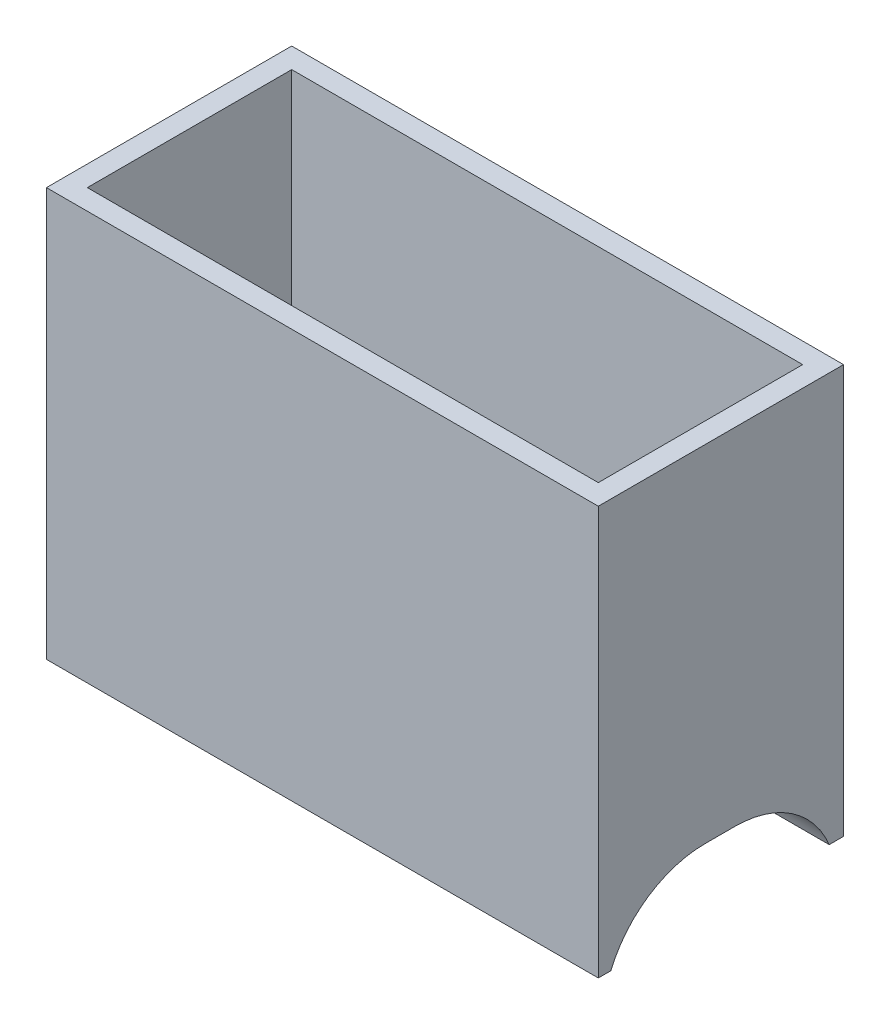
ISO-10303-21;
HEADER;
FILE_DESCRIPTION(('STEP AP214'),'2;1');
FILE_NAME('part.step','',(''),(''),'','','');
FILE_SCHEMA(('AUTOMOTIVE_DESIGN { 1 0 10303 214 1 1 1 1 }'));
ENDSEC;
DATA;
#1=APPLICATION_CONTEXT('core data for automotive mechanical design processes');
#2=APPLICATION_PROTOCOL_DEFINITION('international standard','automotive_design',2000,#1);
#3=PRODUCT_CONTEXT('',#1,'mechanical');
#4=PRODUCT('Part','Part','',(#3));
#5=PRODUCT_RELATED_PRODUCT_CATEGORY('part','',(#4));
#6=PRODUCT_DEFINITION_FORMATION('','',#4);
#7=PRODUCT_DEFINITION_CONTEXT('part definition',#1,'design');
#8=PRODUCT_DEFINITION('design','',#6,#7);
#9=PRODUCT_DEFINITION_SHAPE('','',#8);
#10=(LENGTH_UNIT() NAMED_UNIT(*) SI_UNIT(.MILLI.,.METRE.));
#11=(NAMED_UNIT(*) PLANE_ANGLE_UNIT() SI_UNIT($,.RADIAN.));
#12=(NAMED_UNIT(*) SI_UNIT($,.STERADIAN.) SOLID_ANGLE_UNIT());
#13=UNCERTAINTY_MEASURE_WITH_UNIT(LENGTH_MEASURE(1.E-05),#10,'distance_accuracy_value','');
#14=(GEOMETRIC_REPRESENTATION_CONTEXT(3) GLOBAL_UNCERTAINTY_ASSIGNED_CONTEXT((#13)) GLOBAL_UNIT_ASSIGNED_CONTEXT((#10,
#11,#12)) REPRESENTATION_CONTEXT('',''));
#15=CARTESIAN_POINT('',(0.,0.,0.));
#16=DIRECTION('',(0.,0.,1.));
#17=DIRECTION('',(1.,0.,0.));
#18=AXIS2_PLACEMENT_3D('',#15,#16,#17);
#19=CARTESIAN_POINT('',(0.,30.,0.));
#20=DIRECTION('',(0.,-1.,0.));
#21=DIRECTION('',(1.,0.,0.));
#22=AXIS2_PLACEMENT_3D('',#19,#20,#21);
#23=PLANE('',#22);
#24=DIRECTION('',(1.,0.,0.));
#25=VECTOR('',#24,1.);
#26=CARTESIAN_POINT('',(0.,30.,2.));
#27=LINE('',#26,#25);
#28=CARTESIAN_POINT('',(-52.,30.,2.00000000000001));
#29=VERTEX_POINT('',#28);
#30=CARTESIAN_POINT('',(2.,30.,2.));
#31=VERTEX_POINT('',#30);
#32=EDGE_CURVE('E230',#29,#31,#27,.T.);
#33=ORIENTED_EDGE('',*,*,#32,.T.);
#34=DIRECTION('',(0.,0.,-1.));
#35=VECTOR('',#34,1.);
#36=CARTESIAN_POINT('',(2.,30.,0.));
#37=LINE('',#36,#35);
#38=CARTESIAN_POINT('',(2.,30.,-22.));
#39=VERTEX_POINT('',#38);
#40=EDGE_CURVE('E160',#31,#39,#37,.T.);
#41=ORIENTED_EDGE('',*,*,#40,.T.);
#42=DIRECTION('',(-1.,0.,0.));
#43=VECTOR('',#42,1.);
#44=CARTESIAN_POINT('',(0.,30.,-22.));
#45=LINE('',#44,#43);
#46=CARTESIAN_POINT('',(-52.,30.,-22.));
#47=VERTEX_POINT('',#46);
#48=EDGE_CURVE('E155',#39,#47,#45,.T.);
#49=ORIENTED_EDGE('',*,*,#48,.T.);
#50=DIRECTION('',(0.,0.,1.));
#51=VECTOR('',#50,1.);
#52=CARTESIAN_POINT('',(-52.,30.,0.));
#53=LINE('',#52,#51);
#54=EDGE_CURVE('E221',#47,#29,#53,.T.);
#55=ORIENTED_EDGE('',*,*,#54,.T.);
#56=EDGE_LOOP('',(#33,#41,#49,#55));
#57=FACE_BOUND('',#56,.T.);
#58=DIRECTION('',(1.,0.,0.));
#59=VECTOR('',#58,1.);
#60=CARTESIAN_POINT('',(0.,30.,0.));
#61=LINE('',#60,#59);
#62=CARTESIAN_POINT('',(-50.,30.,0.));
#63=VERTEX_POINT('',#62);
#64=CARTESIAN_POINT('',(0.,30.,0.));
#65=VERTEX_POINT('',#64);
#66=EDGE_CURVE('E209',#63,#65,#61,.T.);
#67=ORIENTED_EDGE('',*,*,#66,.F.);
#68=DIRECTION('',(0.,0.,1.));
#69=VECTOR('',#68,1.);
#70=CARTESIAN_POINT('',(-50.,30.,0.));
#71=LINE('',#70,#69);
#72=CARTESIAN_POINT('',(-50.,30.,-20.));
#73=VERTEX_POINT('',#72);
#74=EDGE_CURVE('E254',#73,#63,#71,.T.);
#75=ORIENTED_EDGE('',*,*,#74,.F.);
#76=DIRECTION('',(-1.,0.,0.));
#77=VECTOR('',#76,1.);
#78=CARTESIAN_POINT('',(0.,30.,-20.));
#79=LINE('',#78,#77);
#80=CARTESIAN_POINT('',(0.,30.,-20.));
#81=VERTEX_POINT('',#80);
#82=EDGE_CURVE('E241',#81,#73,#79,.T.);
#83=ORIENTED_EDGE('',*,*,#82,.F.);
#84=DIRECTION('',(0.,0.,-1.));
#85=VECTOR('',#84,1.);
#86=CARTESIAN_POINT('',(0.,30.,0.));
#87=LINE('',#86,#85);
#88=EDGE_CURVE('E240',#65,#81,#87,.T.);
#89=ORIENTED_EDGE('',*,*,#88,.F.);
#90=EDGE_LOOP('',(#67,#75,#83,#89));
#91=FACE_BOUND('',#90,.T.);
#92=ADVANCED_FACE('F57',(#57,#91),#23,.F.);
#93=CARTESIAN_POINT('',(2.,0.,0.));
#94=DIRECTION('',(1.,0.,0.));
#95=DIRECTION('',(0.,0.,-1.));
#96=AXIS2_PLACEMENT_3D('',#93,#94,#95);
#97=PLANE('',#96);
#98=ORIENTED_EDGE('',*,*,#40,.F.);
#99=DIRECTION('',(0.,1.,0.));
#100=VECTOR('',#99,1.);
#101=CARTESIAN_POINT('',(2.,0.,2.));
#102=LINE('',#101,#100);
#103=CARTESIAN_POINT('',(1.99999999999999,-9.98044530493688,2.00000000000001));
#104=VERTEX_POINT('',#103);
#105=EDGE_CURVE('E218',#104,#31,#102,.T.);
#106=ORIENTED_EDGE('',*,*,#105,.F.);
#107=DIRECTION('',(0.,0.,1.));
#108=VECTOR('',#107,1.);
#109=CARTESIAN_POINT('',(1.99999999999999,-9.98044530493688,0.770065175660507));
#110=LINE('',#109,#108);
#111=CARTESIAN_POINT('',(1.99999999999999,-9.98044530493688,0.770065175660507));
#112=VERTEX_POINT('',#111);
#113=EDGE_CURVE('E172',#112,#104,#110,.T.);
#114=ORIENTED_EDGE('',*,*,#113,.F.);
#115=CARTESIAN_POINT('',(2.,-13.8191781147053,-8.46379265382809));
#116=DIRECTION('',(1.,0.,0.));
#117=DIRECTION('',(0.,0.,-1.));
#118=AXIS2_PLACEMENT_3D('',#115,#116,#117);
#119=CIRCLE('',#118,10.);
#120=CARTESIAN_POINT('',(1.99999999999999,-3.81917811470525,-8.46379265382809));
#121=VERTEX_POINT('',#120);
#122=EDGE_CURVE('E73',#112,#121,#119,.F.);
#123=ORIENTED_EDGE('',*,*,#122,.T.);
#124=DIRECTION('',(0.,0.,1.));
#125=VECTOR('',#124,1.);
#126=CARTESIAN_POINT('',(1.99999999999999,-3.81917811470525,-20.5977155909825));
#127=LINE('',#126,#125);
#128=CARTESIAN_POINT('',(1.99999999999999,-3.81917811470525,-11.363857761494));
#129=VERTEX_POINT('',#128);
#130=EDGE_CURVE('E177',#129,#121,#127,.T.);
#131=ORIENTED_EDGE('',*,*,#130,.F.);
#132=CARTESIAN_POINT('',(2.,-13.8191781147053,-11.363857761494));
#133=DIRECTION('',(1.,0.,0.));
#134=DIRECTION('',(0.,0.,-1.));
#135=AXIS2_PLACEMENT_3D('',#132,#133,#134);
#136=CIRCLE('',#135,10.);
#137=CARTESIAN_POINT('',(1.99999999999999,-9.98044530493688,-20.5977155909825));
#138=VERTEX_POINT('',#137);
#139=EDGE_CURVE('E12',#129,#138,#136,.F.);
#140=ORIENTED_EDGE('',*,*,#139,.T.);
#141=DIRECTION('',(0.,0.,1.));
#142=VECTOR('',#141,1.);
#143=CARTESIAN_POINT('',(1.99999999999999,-9.98044530493688,-22.));
#144=LINE('',#143,#142);
#145=CARTESIAN_POINT('',(1.99999999999999,-9.98044530493688,-22.));
#146=VERTEX_POINT('',#145);
#147=EDGE_CURVE('E166',#146,#138,#144,.T.);
#148=ORIENTED_EDGE('',*,*,#147,.F.);
#149=DIRECTION('',(0.,1.,0.));
#150=VECTOR('',#149,1.);
#151=CARTESIAN_POINT('',(2.,0.,-22.));
#152=LINE('',#151,#150);
#153=EDGE_CURVE('E148',#146,#39,#152,.T.);
#154=ORIENTED_EDGE('',*,*,#153,.T.);
#155=EDGE_LOOP('',(#98,#106,#114,#123,#131,#140,#148,#154));
#156=FACE_BOUND('',#155,.T.);
#157=ADVANCED_FACE('F174',(#156),#97,.T.);
#158=CARTESIAN_POINT('',(0.,0.,-22.));
#159=DIRECTION('',(0.,0.,-1.));
#160=DIRECTION('',(-1.,0.,0.));
#161=AXIS2_PLACEMENT_3D('',#158,#159,#160);
#162=PLANE('',#161);
#163=ORIENTED_EDGE('',*,*,#48,.F.);
#164=ORIENTED_EDGE('',*,*,#153,.F.);
#165=DIRECTION('',(-1.,0.,0.));
#166=VECTOR('',#165,1.);
#167=CARTESIAN_POINT('',(1.99999999999999,-9.98044530493688,-22.));
#168=LINE('',#167,#166);
#169=CARTESIAN_POINT('',(-52.,-9.98044530493688,-22.));
#170=VERTEX_POINT('',#169);
#171=EDGE_CURVE('E152',#146,#170,#168,.T.);
#172=ORIENTED_EDGE('',*,*,#171,.T.);
#173=DIRECTION('',(0.,1.,0.));
#174=VECTOR('',#173,1.);
#175=CARTESIAN_POINT('',(-52.,0.,-22.));
#176=LINE('',#175,#174);
#177=EDGE_CURVE('E224',#170,#47,#176,.T.);
#178=ORIENTED_EDGE('',*,*,#177,.T.);
#179=EDGE_LOOP('',(#163,#164,#172,#178));
#180=FACE_BOUND('',#179,.T.);
#181=ADVANCED_FACE('F150',(#180),#162,.T.);
#182=CARTESIAN_POINT('',(-52.,0.,0.));
#183=DIRECTION('',(-1.,0.,0.));
#184=DIRECTION('',(0.,0.,1.));
#185=AXIS2_PLACEMENT_3D('',#182,#183,#184);
#186=PLANE('',#185);
#187=ORIENTED_EDGE('',*,*,#54,.F.);
#188=ORIENTED_EDGE('',*,*,#177,.F.);
#189=DIRECTION('',(0.,0.,1.));
#190=VECTOR('',#189,1.);
#191=CARTESIAN_POINT('',(-52.,-9.98044530493688,-22.));
#192=LINE('',#191,#190);
#193=CARTESIAN_POINT('',(-52.,-9.98044530493688,-20.5977155909825));
#194=VERTEX_POINT('',#193);
#195=EDGE_CURVE('E169',#170,#194,#192,.T.);
#196=ORIENTED_EDGE('',*,*,#195,.T.);
#197=CARTESIAN_POINT('',(-52.,-13.8191781147053,-11.363857761494));
#198=DIRECTION('',(-1.,0.,0.));
#199=DIRECTION('',(0.,0.,1.));
#200=AXIS2_PLACEMENT_3D('',#197,#198,#199);
#201=CIRCLE('',#200,10.);
#202=CARTESIAN_POINT('',(-52.,-3.81917811470525,-11.363857761494));
#203=VERTEX_POINT('',#202);
#204=EDGE_CURVE('E66',#194,#203,#201,.F.);
#205=ORIENTED_EDGE('',*,*,#204,.T.);
#206=DIRECTION('',(0.,0.,1.));
#207=VECTOR('',#206,1.);
#208=CARTESIAN_POINT('',(-52.,-3.81917811470525,-20.5977155909825));
#209=LINE('',#208,#207);
#210=CARTESIAN_POINT('',(-52.,-3.81917811470525,-8.46379265382809));
#211=VERTEX_POINT('',#210);
#212=EDGE_CURVE('E184',#203,#211,#209,.T.);
#213=ORIENTED_EDGE('',*,*,#212,.T.);
#214=CARTESIAN_POINT('',(-52.,-13.8191781147053,-8.46379265382809));
#215=DIRECTION('',(-1.,0.,0.));
#216=DIRECTION('',(0.,0.,1.));
#217=AXIS2_PLACEMENT_3D('',#214,#215,#216);
#218=CIRCLE('',#217,10.);
#219=CARTESIAN_POINT('',(-52.,-9.98044530493688,0.770065175660507));
#220=VERTEX_POINT('',#219);
#221=EDGE_CURVE('E273',#211,#220,#218,.F.);
#222=ORIENTED_EDGE('',*,*,#221,.T.);
#223=DIRECTION('',(0.,0.,1.));
#224=VECTOR('',#223,1.);
#225=CARTESIAN_POINT('',(-52.,-9.98044530493688,0.770065175660507));
#226=LINE('',#225,#224);
#227=CARTESIAN_POINT('',(-52.,-9.98044530493688,2.00000000000001));
#228=VERTEX_POINT('',#227);
#229=EDGE_CURVE('E178',#220,#228,#226,.T.);
#230=ORIENTED_EDGE('',*,*,#229,.T.);
#231=DIRECTION('',(0.,1.,0.));
#232=VECTOR('',#231,1.);
#233=CARTESIAN_POINT('',(-52.,0.,2.00000000000001));
#234=LINE('',#233,#232);
#235=EDGE_CURVE('E222',#228,#29,#234,.T.);
#236=ORIENTED_EDGE('',*,*,#235,.T.);
#237=EDGE_LOOP('',(#187,#188,#196,#205,#213,#222,#230,#236));
#238=FACE_BOUND('',#237,.T.);
#239=ADVANCED_FACE('F279',(#238),#186,.T.);
#240=CARTESIAN_POINT('',(0.,0.,2.));
#241=DIRECTION('',(0.,0.,1.));
#242=DIRECTION('',(1.,0.,0.));
#243=AXIS2_PLACEMENT_3D('',#240,#241,#242);
#244=PLANE('',#243);
#245=ORIENTED_EDGE('',*,*,#32,.F.);
#246=ORIENTED_EDGE('',*,*,#235,.F.);
#247=DIRECTION('',(-1.,0.,0.));
#248=VECTOR('',#247,1.);
#249=CARTESIAN_POINT('',(1.99999999999999,-9.98044530493688,2.00000000000001));
#250=LINE('',#249,#248);
#251=EDGE_CURVE('E195',#104,#228,#250,.T.);
#252=ORIENTED_EDGE('',*,*,#251,.F.);
#253=ORIENTED_EDGE('',*,*,#105,.T.);
#254=EDGE_LOOP('',(#245,#246,#252,#253));
#255=FACE_BOUND('',#254,.T.);
#256=ADVANCED_FACE('F302',(#255),#244,.T.);
#257=CARTESIAN_POINT('',(0.,0.,0.));
#258=DIRECTION('',(1.,0.,0.));
#259=DIRECTION('',(0.,0.,-1.));
#260=AXIS2_PLACEMENT_3D('',#257,#258,#259);
#261=PLANE('',#260);
#262=DIRECTION('',(0.,1.,0.));
#263=VECTOR('',#262,1.);
#264=CARTESIAN_POINT('',(0.,0.,-20.));
#265=LINE('',#264,#263);
#266=CARTESIAN_POINT('',(0.,2.,-20.));
#267=VERTEX_POINT('',#266);
#268=EDGE_CURVE('E245',#267,#81,#265,.T.);
#269=ORIENTED_EDGE('',*,*,#268,.F.);
#270=DIRECTION('',(0.,0.,1.));
#271=VECTOR('',#270,1.);
#272=CARTESIAN_POINT('',(0.,2.,-20.));
#273=LINE('',#272,#271);
#274=CARTESIAN_POINT('',(0.,2.,0.));
#275=VERTEX_POINT('',#274);
#276=EDGE_CURVE('E213',#275,#267,#273,.F.);
#277=ORIENTED_EDGE('',*,*,#276,.F.);
#278=DIRECTION('',(0.,1.,0.));
#279=VECTOR('',#278,1.);
#280=CARTESIAN_POINT('',(0.,0.,0.));
#281=LINE('',#280,#279);
#282=EDGE_CURVE('E258',#275,#65,#281,.T.);
#283=ORIENTED_EDGE('',*,*,#282,.T.);
#284=ORIENTED_EDGE('',*,*,#88,.T.);
#285=EDGE_LOOP('',(#269,#277,#283,#284));
#286=FACE_BOUND('',#285,.T.);
#287=ADVANCED_FACE('F298',(#286),#261,.F.);
#288=CARTESIAN_POINT('',(0.,0.,-20.));
#289=DIRECTION('',(0.,0.,-1.));
#290=DIRECTION('',(-1.,0.,0.));
#291=AXIS2_PLACEMENT_3D('',#288,#289,#290);
#292=PLANE('',#291);
#293=DIRECTION('',(0.,1.,0.));
#294=VECTOR('',#293,1.);
#295=CARTESIAN_POINT('',(-50.,0.,-20.));
#296=LINE('',#295,#294);
#297=CARTESIAN_POINT('',(-50.,2.,-20.));
#298=VERTEX_POINT('',#297);
#299=EDGE_CURVE('E246',#298,#73,#296,.T.);
#300=ORIENTED_EDGE('',*,*,#299,.F.);
#301=DIRECTION('',(1.,0.,0.));
#302=VECTOR('',#301,1.);
#303=CARTESIAN_POINT('',(-50.,2.,-20.));
#304=LINE('',#303,#302);
#305=EDGE_CURVE('E199',#267,#298,#304,.F.);
#306=ORIENTED_EDGE('',*,*,#305,.F.);
#307=ORIENTED_EDGE('',*,*,#268,.T.);
#308=ORIENTED_EDGE('',*,*,#82,.T.);
#309=EDGE_LOOP('',(#300,#306,#307,#308));
#310=FACE_BOUND('',#309,.T.);
#311=ADVANCED_FACE('F301',(#310),#292,.F.);
#312=CARTESIAN_POINT('',(-50.,0.,0.));
#313=DIRECTION('',(-1.,0.,0.));
#314=DIRECTION('',(0.,0.,1.));
#315=AXIS2_PLACEMENT_3D('',#312,#313,#314);
#316=PLANE('',#315);
#317=DIRECTION('',(0.,1.,0.));
#318=VECTOR('',#317,1.);
#319=CARTESIAN_POINT('',(-50.,0.,0.));
#320=LINE('',#319,#318);
#321=CARTESIAN_POINT('',(-50.,2.,0.));
#322=VERTEX_POINT('',#321);
#323=EDGE_CURVE('E253',#322,#63,#320,.T.);
#324=ORIENTED_EDGE('',*,*,#323,.F.);
#325=DIRECTION('',(0.,0.,1.));
#326=VECTOR('',#325,1.);
#327=CARTESIAN_POINT('',(-50.,2.,-20.));
#328=LINE('',#327,#326);
#329=EDGE_CURVE('E206',#298,#322,#328,.T.);
#330=ORIENTED_EDGE('',*,*,#329,.F.);
#331=ORIENTED_EDGE('',*,*,#299,.T.);
#332=ORIENTED_EDGE('',*,*,#74,.T.);
#333=EDGE_LOOP('',(#324,#330,#331,#332));
#334=FACE_BOUND('',#333,.T.);
#335=ADVANCED_FACE('F306',(#334),#316,.F.);
#336=CARTESIAN_POINT('',(0.,0.,0.));
#337=DIRECTION('',(0.,0.,1.));
#338=DIRECTION('',(1.,0.,0.));
#339=AXIS2_PLACEMENT_3D('',#336,#337,#338);
#340=PLANE('',#339);
#341=ORIENTED_EDGE('',*,*,#282,.F.);
#342=DIRECTION('',(1.,0.,0.));
#343=VECTOR('',#342,1.);
#344=CARTESIAN_POINT('',(-50.,2.,0.));
#345=LINE('',#344,#343);
#346=EDGE_CURVE('E210',#322,#275,#345,.T.);
#347=ORIENTED_EDGE('',*,*,#346,.F.);
#348=ORIENTED_EDGE('',*,*,#323,.T.);
#349=ORIENTED_EDGE('',*,*,#66,.T.);
#350=EDGE_LOOP('',(#341,#347,#348,#349));
#351=FACE_BOUND('',#350,.T.);
#352=ADVANCED_FACE('F310',(#351),#340,.F.);
#353=CARTESIAN_POINT('',(-50.,2.,-20.));
#354=DIRECTION('',(0.,1.,0.));
#355=DIRECTION('',(0.,0.,1.));
#356=AXIS2_PLACEMENT_3D('',#353,#354,#355);
#357=PLANE('',#356);
#358=ORIENTED_EDGE('',*,*,#329,.T.);
#359=ORIENTED_EDGE('',*,*,#346,.T.);
#360=ORIENTED_EDGE('',*,*,#276,.T.);
#361=ORIENTED_EDGE('',*,*,#305,.T.);
#362=EDGE_LOOP('',(#358,#359,#360,#361));
#363=FACE_BOUND('',#362,.T.);
#364=ADVANCED_FACE('F314',(#363),#357,.T.);
#365=CARTESIAN_POINT('',(1.99999999999999,-9.98044530493688,0.770065175660507));
#366=DIRECTION('',(0.,-1.,0.));
#367=DIRECTION('',(0.,0.,-1.));
#368=AXIS2_PLACEMENT_3D('',#365,#366,#367);
#369=PLANE('',#368);
#370=ORIENTED_EDGE('',*,*,#229,.F.);
#371=DIRECTION('',(-1.,0.,0.));
#372=VECTOR('',#371,1.);
#373=CARTESIAN_POINT('',(1.99999999999999,-9.98044530493688,0.770065175660507));
#374=LINE('',#373,#372);
#375=EDGE_CURVE('E200',#112,#220,#374,.T.);
#376=ORIENTED_EDGE('',*,*,#375,.F.);
#377=ORIENTED_EDGE('',*,*,#113,.T.);
#378=ORIENTED_EDGE('',*,*,#251,.T.);
#379=EDGE_LOOP('',(#370,#376,#377,#378));
#380=FACE_BOUND('',#379,.T.);
#381=ADVANCED_FACE('F325',(#380),#369,.T.);
#382=CARTESIAN_POINT('',(1.99999999999999,-3.81917811470525,-20.5977155909825));
#383=DIRECTION('',(0.,-1.,0.));
#384=DIRECTION('',(0.,0.,-1.));
#385=AXIS2_PLACEMENT_3D('',#382,#383,#384);
#386=PLANE('',#385);
#387=ORIENTED_EDGE('',*,*,#130,.T.);
#388=DIRECTION('',(1.,0.,0.));
#389=VECTOR('',#388,1.);
#390=CARTESIAN_POINT('',(-52.,-3.81917811470525,-8.46379265382809));
#391=LINE('',#390,#389);
#392=EDGE_CURVE('E269',#121,#211,#391,.F.);
#393=ORIENTED_EDGE('',*,*,#392,.T.);
#394=ORIENTED_EDGE('',*,*,#212,.F.);
#395=DIRECTION('',(-1.,0.,0.));
#396=VECTOR('',#395,1.);
#397=CARTESIAN_POINT('',(1.99999999999999,-3.81917811470525,-11.363857761494));
#398=LINE('',#397,#396);
#399=EDGE_CURVE('E80',#203,#129,#398,.F.);
#400=ORIENTED_EDGE('',*,*,#399,.T.);
#401=EDGE_LOOP('',(#387,#393,#394,#400));
#402=FACE_BOUND('',#401,.T.);
#403=ADVANCED_FACE('F281',(#402),#386,.T.);
#404=CARTESIAN_POINT('',(1.99999999999999,-9.98044530493688,-22.));
#405=DIRECTION('',(0.,-1.,0.));
#406=DIRECTION('',(0.,0.,-1.));
#407=AXIS2_PLACEMENT_3D('',#404,#405,#406);
#408=PLANE('',#407);
#409=ORIENTED_EDGE('',*,*,#195,.F.);
#410=ORIENTED_EDGE('',*,*,#171,.F.);
#411=ORIENTED_EDGE('',*,*,#147,.T.);
#412=DIRECTION('',(-1.,0.,0.));
#413=VECTOR('',#412,1.);
#414=CARTESIAN_POINT('',(1.99999999999999,-9.98044530493688,-20.5977155909825));
#415=LINE('',#414,#413);
#416=EDGE_CURVE('E171',#138,#194,#415,.T.);
#417=ORIENTED_EDGE('',*,*,#416,.T.);
#418=EDGE_LOOP('',(#409,#410,#411,#417));
#419=FACE_BOUND('',#418,.T.);
#420=ADVANCED_FACE('F164',(#419),#408,.T.);
#421=CARTESIAN_POINT('',(1.99999999999999,-13.8191781147053,-8.46379265382809));
#422=DIRECTION('',(-1.,0.,0.));
#423=DIRECTION('',(0.,0.,1.));
#424=AXIS2_PLACEMENT_3D('',#421,#422,#423);
#425=CYLINDRICAL_SURFACE('',#424,10.);
#426=ORIENTED_EDGE('',*,*,#122,.F.);
#427=ORIENTED_EDGE('',*,*,#375,.T.);
#428=ORIENTED_EDGE('',*,*,#221,.F.);
#429=ORIENTED_EDGE('',*,*,#392,.F.);
#430=EDGE_LOOP('',(#426,#427,#428,#429));
#431=FACE_BOUND('',#430,.T.);
#432=ADVANCED_FACE('F284',(#431),#425,.F.);
#433=CARTESIAN_POINT('',(1.99999999999999,-13.8191781147053,-11.363857761494));
#434=DIRECTION('',(1.,0.,0.));
#435=DIRECTION('',(0.,0.,-1.));
#436=AXIS2_PLACEMENT_3D('',#433,#434,#435);
#437=CYLINDRICAL_SURFACE('',#436,10.);
#438=ORIENTED_EDGE('',*,*,#139,.F.);
#439=ORIENTED_EDGE('',*,*,#399,.F.);
#440=ORIENTED_EDGE('',*,*,#204,.F.);
#441=ORIENTED_EDGE('',*,*,#416,.F.);
#442=EDGE_LOOP('',(#438,#439,#440,#441));
#443=FACE_BOUND('',#442,.T.);
#444=ADVANCED_FACE('F59',(#443),#437,.F.);
#445=CLOSED_SHELL('',(#92,#157,#181,#239,#256,#287,#311,#335,#352,#364,#381,#403,#420,#432,#444));
#446=MANIFOLD_SOLID_BREP('B2',#445);
#447=ADVANCED_BREP_SHAPE_REPRESENTATION('',(#18,#446),#14);
#448=SHAPE_DEFINITION_REPRESENTATION(#9,#447);
ENDSEC;
END-ISO-10303-21;
